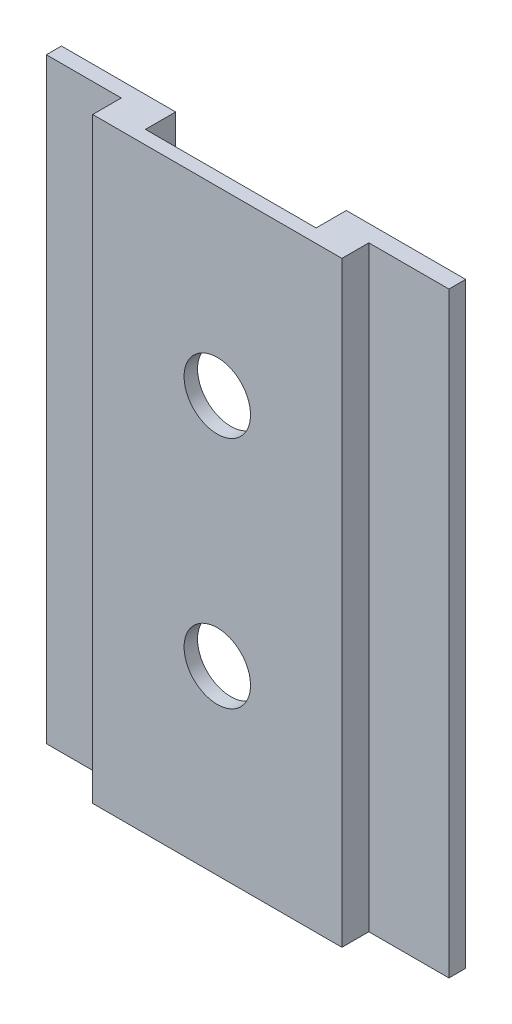
ISO-10303-21;
HEADER;
FILE_DESCRIPTION(('STEP AP214'),'2;1');
FILE_NAME('part.step','',(''),(''),'','','');
FILE_SCHEMA(('AUTOMOTIVE_DESIGN { 1 0 10303 214 1 1 1 1 }'));
ENDSEC;
DATA;
#1=APPLICATION_CONTEXT('core data for automotive mechanical design processes');
#2=APPLICATION_PROTOCOL_DEFINITION('international standard','automotive_design',2000,#1);
#3=PRODUCT_CONTEXT('',#1,'mechanical');
#4=PRODUCT('Part','Part','',(#3));
#5=PRODUCT_RELATED_PRODUCT_CATEGORY('part','',(#4));
#6=PRODUCT_DEFINITION_FORMATION('','',#4);
#7=PRODUCT_DEFINITION_CONTEXT('part definition',#1,'design');
#8=PRODUCT_DEFINITION('design','',#6,#7);
#9=PRODUCT_DEFINITION_SHAPE('','',#8);
#10=(LENGTH_UNIT() NAMED_UNIT(*) SI_UNIT(.MILLI.,.METRE.));
#11=(NAMED_UNIT(*) PLANE_ANGLE_UNIT() SI_UNIT($,.RADIAN.));
#12=(NAMED_UNIT(*) SI_UNIT($,.STERADIAN.) SOLID_ANGLE_UNIT());
#13=UNCERTAINTY_MEASURE_WITH_UNIT(LENGTH_MEASURE(1.E-05),#10,'distance_accuracy_value','');
#14=(GEOMETRIC_REPRESENTATION_CONTEXT(3) GLOBAL_UNCERTAINTY_ASSIGNED_CONTEXT((#13)) GLOBAL_UNIT_ASSIGNED_CONTEXT((#10,
#11,#12)) REPRESENTATION_CONTEXT('',''));
#15=CARTESIAN_POINT('',(0.,0.,0.));
#16=DIRECTION('',(0.,0.,1.));
#17=DIRECTION('',(1.,0.,0.));
#18=AXIS2_PLACEMENT_3D('',#15,#16,#17);
#19=CARTESIAN_POINT('',(0.,50.165,-2.40322636926087));
#20=DIRECTION('',(1.,0.,0.));
#21=DIRECTION('',(0.,0.,-1.));
#22=AXIS2_PLACEMENT_3D('',#19,#20,#21);
#23=PLANE('',#22);
#24=DIRECTION('',(0.,0.,1.));
#25=VECTOR('',#24,1.);
#26=CARTESIAN_POINT('',(0.,0.,-2.40322636926087));
#27=LINE('',#26,#25);
#28=CARTESIAN_POINT('',(0.,0.,-2.40322636926087));
#29=VERTEX_POINT('',#28);
#30=CARTESIAN_POINT('',(0.,0.,0.));
#31=VERTEX_POINT('',#30);
#32=EDGE_CURVE('E166',#29,#31,#27,.T.);
#33=ORIENTED_EDGE('',*,*,#32,.T.);
#34=DIRECTION('',(0.,-1.,0.));
#35=VECTOR('',#34,1.);
#36=CARTESIAN_POINT('',(0.,50.165,0.));
#37=LINE('',#36,#35);
#38=CARTESIAN_POINT('',(0.,50.165,0.));
#39=VERTEX_POINT('',#38);
#40=EDGE_CURVE('E11',#39,#31,#37,.T.);
#41=ORIENTED_EDGE('',*,*,#40,.F.);
#42=DIRECTION('',(0.,0.,1.));
#43=VECTOR('',#42,1.);
#44=CARTESIAN_POINT('',(0.,50.165,-2.40322636926087));
#45=LINE('',#44,#43);
#46=CARTESIAN_POINT('',(0.,50.165,-2.40322636926087));
#47=VERTEX_POINT('',#46);
#48=EDGE_CURVE('E195',#47,#39,#45,.T.);
#49=ORIENTED_EDGE('',*,*,#48,.F.);
#50=DIRECTION('',(0.,-1.,0.));
#51=VECTOR('',#50,1.);
#52=CARTESIAN_POINT('',(0.,50.165,-2.40322636926087));
#53=LINE('',#52,#51);
#54=EDGE_CURVE('E162',#47,#29,#53,.T.);
#55=ORIENTED_EDGE('',*,*,#54,.T.);
#56=EDGE_LOOP('',(#33,#41,#49,#55));
#57=FACE_BOUND('',#56,.T.);
#58=ADVANCED_FACE('F41',(#57),#23,.F.);
#59=CARTESIAN_POINT('',(0.,50.165,0.));
#60=DIRECTION('',(0.,0.,-1.));
#61=DIRECTION('',(-1.,0.,0.));
#62=AXIS2_PLACEMENT_3D('',#59,#60,#61);
#63=PLANE('',#62);
#64=CARTESIAN_POINT('',(10.4775,15.24,0.));
#65=DIRECTION('',(0.,0.,-1.));
#66=DIRECTION('',(-1.,0.,0.));
#67=AXIS2_PLACEMENT_3D('',#64,#65,#66);
#68=CIRCLE('',#67,2.794);
#69=CARTESIAN_POINT('',(7.6835,15.24,0.));
#70=VERTEX_POINT('',#69);
#71=EDGE_CURVE('E375',#70,#70,#68,.T.);
#72=ORIENTED_EDGE('',*,*,#71,.T.);
#73=EDGE_LOOP('',(#72));
#74=FACE_BOUND('',#73,.T.);
#75=CARTESIAN_POINT('',(10.4775,34.925,0.));
#76=DIRECTION('',(0.,0.,-1.));
#77=DIRECTION('',(-1.,0.,0.));
#78=AXIS2_PLACEMENT_3D('',#75,#76,#77);
#79=CIRCLE('',#78,2.794);
#80=CARTESIAN_POINT('',(7.6835,34.925,0.));
#81=VERTEX_POINT('',#80);
#82=EDGE_CURVE('E171',#81,#81,#79,.T.);
#83=ORIENTED_EDGE('',*,*,#82,.T.);
#84=EDGE_LOOP('',(#83));
#85=FACE_BOUND('',#84,.T.);
#86=DIRECTION('',(1.,0.,0.));
#87=VECTOR('',#86,1.);
#88=CARTESIAN_POINT('',(0.,0.,0.));
#89=LINE('',#88,#87);
#90=CARTESIAN_POINT('',(20.955,0.,0.));
#91=VERTEX_POINT('',#90);
#92=EDGE_CURVE('E170',#31,#91,#89,.T.);
#93=ORIENTED_EDGE('',*,*,#92,.T.);
#94=DIRECTION('',(0.,-1.,0.));
#95=VECTOR('',#94,1.);
#96=CARTESIAN_POINT('',(20.955,50.165,0.));
#97=LINE('',#96,#95);
#98=CARTESIAN_POINT('',(20.955,50.165,0.));
#99=VERTEX_POINT('',#98);
#100=EDGE_CURVE('E50',#99,#91,#97,.T.);
#101=ORIENTED_EDGE('',*,*,#100,.F.);
#102=DIRECTION('',(1.,0.,0.));
#103=VECTOR('',#102,1.);
#104=CARTESIAN_POINT('',(0.,50.165,0.));
#105=LINE('',#104,#103);
#106=EDGE_CURVE('E117',#39,#99,#105,.T.);
#107=ORIENTED_EDGE('',*,*,#106,.F.);
#108=ORIENTED_EDGE('',*,*,#40,.T.);
#109=EDGE_LOOP('',(#93,#101,#107,#108));
#110=FACE_BOUND('',#109,.T.);
#111=ADVANCED_FACE('F276',(#74,#85,#110),#63,.F.);
#112=CARTESIAN_POINT('',(20.955,50.165,0.));
#113=DIRECTION('',(-1.,0.,0.));
#114=DIRECTION('',(0.,0.,1.));
#115=AXIS2_PLACEMENT_3D('',#112,#113,#114);
#116=PLANE('',#115);
#117=DIRECTION('',(0.,0.,-1.));
#118=VECTOR('',#117,1.);
#119=CARTESIAN_POINT('',(20.955,0.,0.));
#120=LINE('',#119,#118);
#121=CARTESIAN_POINT('',(20.955,0.,-2.265814212368));
#122=VERTEX_POINT('',#121);
#123=EDGE_CURVE('E174',#91,#122,#120,.T.);
#124=ORIENTED_EDGE('',*,*,#123,.T.);
#125=DIRECTION('',(0.,-1.,0.));
#126=VECTOR('',#125,1.);
#127=CARTESIAN_POINT('',(20.955,50.165,-2.265814212368));
#128=LINE('',#127,#126);
#129=CARTESIAN_POINT('',(20.955,50.165,-2.265814212368));
#130=VERTEX_POINT('',#129);
#131=EDGE_CURVE('E217',#130,#122,#128,.T.);
#132=ORIENTED_EDGE('',*,*,#131,.F.);
#133=DIRECTION('',(0.,0.,-1.));
#134=VECTOR('',#133,1.);
#135=CARTESIAN_POINT('',(20.955,50.165,0.));
#136=LINE('',#135,#134);
#137=EDGE_CURVE('E225',#99,#130,#136,.T.);
#138=ORIENTED_EDGE('',*,*,#137,.F.);
#139=ORIENTED_EDGE('',*,*,#100,.T.);
#140=EDGE_LOOP('',(#124,#132,#138,#139));
#141=FACE_BOUND('',#140,.T.);
#142=ADVANCED_FACE('F223',(#141),#116,.F.);
#143=CARTESIAN_POINT('',(20.955,50.165,-2.265814212368));
#144=DIRECTION('',(0.,0.,-1.));
#145=DIRECTION('',(-1.,0.,0.));
#146=AXIS2_PLACEMENT_3D('',#143,#144,#145);
#147=PLANE('',#146);
#148=DIRECTION('',(1.,0.,0.));
#149=VECTOR('',#148,1.);
#150=CARTESIAN_POINT('',(20.955,0.,-2.265814212368));
#151=LINE('',#150,#149);
#152=CARTESIAN_POINT('',(27.686,0.,-2.265814212368));
#153=VERTEX_POINT('',#152);
#154=EDGE_CURVE('E176',#122,#153,#151,.T.);
#155=ORIENTED_EDGE('',*,*,#154,.T.);
#156=DIRECTION('',(0.,-1.,0.));
#157=VECTOR('',#156,1.);
#158=CARTESIAN_POINT('',(27.686,50.165,-2.265814212368));
#159=LINE('',#158,#157);
#160=CARTESIAN_POINT('',(27.686,50.165,-2.265814212368));
#161=VERTEX_POINT('',#160);
#162=EDGE_CURVE('E214',#161,#153,#159,.T.);
#163=ORIENTED_EDGE('',*,*,#162,.F.);
#164=DIRECTION('',(1.,0.,0.));
#165=VECTOR('',#164,1.);
#166=CARTESIAN_POINT('',(20.955,50.165,-2.265814212368));
#167=LINE('',#166,#165);
#168=EDGE_CURVE('E243',#130,#161,#167,.T.);
#169=ORIENTED_EDGE('',*,*,#168,.F.);
#170=ORIENTED_EDGE('',*,*,#131,.T.);
#171=EDGE_LOOP('',(#155,#163,#169,#170));
#172=FACE_BOUND('',#171,.T.);
#173=ADVANCED_FACE('F234',(#172),#147,.F.);
#174=CARTESIAN_POINT('',(27.686,50.165,-2.265814212368));
#175=DIRECTION('',(-1.,0.,0.));
#176=DIRECTION('',(0.,0.,1.));
#177=AXIS2_PLACEMENT_3D('',#174,#175,#176);
#178=PLANE('',#177);
#179=DIRECTION('',(0.,0.,-1.));
#180=VECTOR('',#179,1.);
#181=CARTESIAN_POINT('',(27.686,0.,-2.265814212368));
#182=LINE('',#181,#180);
#183=CARTESIAN_POINT('',(27.686,0.,-3.67354563233775));
#184=VERTEX_POINT('',#183);
#185=EDGE_CURVE('E178',#153,#184,#182,.T.);
#186=ORIENTED_EDGE('',*,*,#185,.T.);
#187=DIRECTION('',(0.,-1.,0.));
#188=VECTOR('',#187,1.);
#189=CARTESIAN_POINT('',(27.686,50.165,-3.67354563233775));
#190=LINE('',#189,#188);
#191=CARTESIAN_POINT('',(27.686,50.165,-3.67354563233775));
#192=VERTEX_POINT('',#191);
#193=EDGE_CURVE('E211',#192,#184,#190,.T.);
#194=ORIENTED_EDGE('',*,*,#193,.F.);
#195=DIRECTION('',(0.,0.,-1.));
#196=VECTOR('',#195,1.);
#197=CARTESIAN_POINT('',(27.686,50.165,-2.265814212368));
#198=LINE('',#197,#196);
#199=EDGE_CURVE('E240',#161,#192,#198,.T.);
#200=ORIENTED_EDGE('',*,*,#199,.F.);
#201=ORIENTED_EDGE('',*,*,#162,.T.);
#202=EDGE_LOOP('',(#186,#194,#200,#201));
#203=FACE_BOUND('',#202,.T.);
#204=ADVANCED_FACE('F238',(#203),#178,.F.);
#205=CARTESIAN_POINT('',(27.686,50.165,-3.67354563233775));
#206=DIRECTION('',(0.,0.,1.));
#207=DIRECTION('',(1.,0.,0.));
#208=AXIS2_PLACEMENT_3D('',#205,#206,#207);
#209=PLANE('',#208);
#210=DIRECTION('',(-1.,0.,0.));
#211=VECTOR('',#210,1.);
#212=CARTESIAN_POINT('',(27.686,0.,-3.67354563233775));
#213=LINE('',#212,#211);
#214=CARTESIAN_POINT('',(17.653,0.,-3.67354563233775));
#215=VERTEX_POINT('',#214);
#216=EDGE_CURVE('E180',#184,#215,#213,.T.);
#217=ORIENTED_EDGE('',*,*,#216,.T.);
#218=DIRECTION('',(0.,-1.,0.));
#219=VECTOR('',#218,1.);
#220=CARTESIAN_POINT('',(17.653,50.165,-3.67354563233775));
#221=LINE('',#220,#219);
#222=CARTESIAN_POINT('',(17.653,50.165,-3.67354563233775));
#223=VERTEX_POINT('',#222);
#224=EDGE_CURVE('E208',#223,#215,#221,.T.);
#225=ORIENTED_EDGE('',*,*,#224,.F.);
#226=DIRECTION('',(-1.,0.,0.));
#227=VECTOR('',#226,1.);
#228=CARTESIAN_POINT('',(27.686,50.165,-3.67354563233775));
#229=LINE('',#228,#227);
#230=EDGE_CURVE('E242',#192,#223,#229,.T.);
#231=ORIENTED_EDGE('',*,*,#230,.F.);
#232=ORIENTED_EDGE('',*,*,#193,.T.);
#233=EDGE_LOOP('',(#217,#225,#231,#232));
#234=FACE_BOUND('',#233,.T.);
#235=ADVANCED_FACE('F292',(#234),#209,.F.);
#236=CARTESIAN_POINT('',(17.653,50.165,-3.67354563233775));
#237=DIRECTION('',(1.,0.,0.));
#238=DIRECTION('',(0.,0.,-1.));
#239=AXIS2_PLACEMENT_3D('',#236,#237,#238);
#240=PLANE('',#239);
#241=DIRECTION('',(0.,0.,1.));
#242=VECTOR('',#241,1.);
#243=CARTESIAN_POINT('',(17.653,0.,-3.67354563233775));
#244=LINE('',#243,#242);
#245=CARTESIAN_POINT('',(17.653,0.,-1.132907106184));
#246=VERTEX_POINT('',#245);
#247=EDGE_CURVE('E182',#215,#246,#244,.T.);
#248=ORIENTED_EDGE('',*,*,#247,.T.);
#249=DIRECTION('',(0.,-1.,0.));
#250=VECTOR('',#249,1.);
#251=CARTESIAN_POINT('',(17.653,50.165,-1.132907106184));
#252=LINE('',#251,#250);
#253=CARTESIAN_POINT('',(17.653,50.165,-1.132907106184));
#254=VERTEX_POINT('',#253);
#255=EDGE_CURVE('E205',#254,#246,#252,.T.);
#256=ORIENTED_EDGE('',*,*,#255,.F.);
#257=DIRECTION('',(0.,0.,1.));
#258=VECTOR('',#257,1.);
#259=CARTESIAN_POINT('',(17.653,50.165,-3.67354563233775));
#260=LINE('',#259,#258);
#261=EDGE_CURVE('E245',#223,#254,#260,.T.);
#262=ORIENTED_EDGE('',*,*,#261,.F.);
#263=ORIENTED_EDGE('',*,*,#224,.T.);
#264=EDGE_LOOP('',(#248,#256,#262,#263));
#265=FACE_BOUND('',#264,.T.);
#266=ADVANCED_FACE('F295',(#265),#240,.F.);
#267=CARTESIAN_POINT('',(17.653,50.165,-1.132907106184));
#268=DIRECTION('',(0.,0.,1.));
#269=DIRECTION('',(1.,0.,0.));
#270=AXIS2_PLACEMENT_3D('',#267,#268,#269);
#271=PLANE('',#270);
#272=CARTESIAN_POINT('',(10.4775,15.24,-1.132907106184));
#273=DIRECTION('',(0.,0.,-1.));
#274=DIRECTION('',(1.,0.,0.));
#275=AXIS2_PLACEMENT_3D('',#272,#273,#274);
#276=CIRCLE('',#275,2.794);
#277=CARTESIAN_POINT('',(13.2715,15.24,-1.132907106184));
#278=VERTEX_POINT('',#277);
#279=EDGE_CURVE('E373',#278,#278,#276,.T.);
#280=ORIENTED_EDGE('',*,*,#279,.F.);
#281=EDGE_LOOP('',(#280));
#282=FACE_BOUND('',#281,.T.);
#283=CARTESIAN_POINT('',(10.4775,34.925,-1.132907106184));
#284=DIRECTION('',(0.,0.,-1.));
#285=DIRECTION('',(-1.,0.,0.));
#286=AXIS2_PLACEMENT_3D('',#283,#284,#285);
#287=CIRCLE('',#286,2.794);
#288=CARTESIAN_POINT('',(7.6835,34.925,-1.132907106184));
#289=VERTEX_POINT('',#288);
#290=EDGE_CURVE('E376',#289,#289,#287,.T.);
#291=ORIENTED_EDGE('',*,*,#290,.F.);
#292=EDGE_LOOP('',(#291));
#293=FACE_BOUND('',#292,.T.);
#294=DIRECTION('',(-1.,0.,0.));
#295=VECTOR('',#294,1.);
#296=CARTESIAN_POINT('',(17.653,0.,-1.132907106184));
#297=LINE('',#296,#295);
#298=CARTESIAN_POINT('',(3.302,0.,-1.132907106184));
#299=VERTEX_POINT('',#298);
#300=EDGE_CURVE('E184',#246,#299,#297,.T.);
#301=ORIENTED_EDGE('',*,*,#300,.T.);
#302=DIRECTION('',(0.,-1.,0.));
#303=VECTOR('',#302,1.);
#304=CARTESIAN_POINT('',(3.302,50.165,-1.132907106184));
#305=LINE('',#304,#303);
#306=CARTESIAN_POINT('',(3.302,50.165,-1.132907106184));
#307=VERTEX_POINT('',#306);
#308=EDGE_CURVE('E201',#307,#299,#305,.T.);
#309=ORIENTED_EDGE('',*,*,#308,.F.);
#310=DIRECTION('',(-1.,0.,0.));
#311=VECTOR('',#310,1.);
#312=CARTESIAN_POINT('',(17.653,50.165,-1.132907106184));
#313=LINE('',#312,#311);
#314=EDGE_CURVE('E251',#254,#307,#313,.T.);
#315=ORIENTED_EDGE('',*,*,#314,.F.);
#316=ORIENTED_EDGE('',*,*,#255,.T.);
#317=EDGE_LOOP('',(#301,#309,#315,#316));
#318=FACE_BOUND('',#317,.T.);
#319=ADVANCED_FACE('F257',(#282,#293,#318),#271,.F.);
#320=CARTESIAN_POINT('',(3.302,50.165,-1.132907106184));
#321=DIRECTION('',(-1.,0.,0.));
#322=DIRECTION('',(0.,0.,1.));
#323=AXIS2_PLACEMENT_3D('',#320,#321,#322);
#324=PLANE('',#323);
#325=DIRECTION('',(0.,0.,-1.));
#326=VECTOR('',#325,1.);
#327=CARTESIAN_POINT('',(3.302,0.,-1.132907106184));
#328=LINE('',#327,#326);
#329=CARTESIAN_POINT('',(3.302,0.,-3.67354563233775));
#330=VERTEX_POINT('',#329);
#331=EDGE_CURVE('E187',#299,#330,#328,.T.);
#332=ORIENTED_EDGE('',*,*,#331,.T.);
#333=DIRECTION('',(0.,-1.,0.));
#334=VECTOR('',#333,1.);
#335=CARTESIAN_POINT('',(3.302,50.165,-3.67354563233775));
#336=LINE('',#335,#334);
#337=CARTESIAN_POINT('',(3.302,50.165,-3.67354563233775));
#338=VERTEX_POINT('',#337);
#339=EDGE_CURVE('E157',#338,#330,#336,.T.);
#340=ORIENTED_EDGE('',*,*,#339,.F.);
#341=DIRECTION('',(0.,0.,-1.));
#342=VECTOR('',#341,1.);
#343=CARTESIAN_POINT('',(3.302,50.165,-1.132907106184));
#344=LINE('',#343,#342);
#345=EDGE_CURVE('E148',#307,#338,#344,.T.);
#346=ORIENTED_EDGE('',*,*,#345,.F.);
#347=ORIENTED_EDGE('',*,*,#308,.T.);
#348=EDGE_LOOP('',(#332,#340,#346,#347));
#349=FACE_BOUND('',#348,.T.);
#350=ADVANCED_FACE('F261',(#349),#324,.F.);
#351=CARTESIAN_POINT('',(3.302,50.165,-3.67354563233775));
#352=DIRECTION('',(0.,0.,1.));
#353=DIRECTION('',(1.,0.,0.));
#354=AXIS2_PLACEMENT_3D('',#351,#352,#353);
#355=PLANE('',#354);
#356=DIRECTION('',(-1.,0.,0.));
#357=VECTOR('',#356,1.);
#358=CARTESIAN_POINT('',(3.302,0.,-3.67354563233775));
#359=LINE('',#358,#357);
#360=CARTESIAN_POINT('',(-6.2992,0.,-3.67354563233775));
#361=VERTEX_POINT('',#360);
#362=EDGE_CURVE('E156',#330,#361,#359,.T.);
#363=ORIENTED_EDGE('',*,*,#362,.T.);
#364=DIRECTION('',(0.,-1.,0.));
#365=VECTOR('',#364,1.);
#366=CARTESIAN_POINT('',(-6.2992,50.165,-3.67354563233775));
#367=LINE('',#366,#365);
#368=CARTESIAN_POINT('',(-6.2992,50.165,-3.67354563233775));
#369=VERTEX_POINT('',#368);
#370=EDGE_CURVE('E153',#369,#361,#367,.T.);
#371=ORIENTED_EDGE('',*,*,#370,.F.);
#372=DIRECTION('',(-1.,0.,0.));
#373=VECTOR('',#372,1.);
#374=CARTESIAN_POINT('',(3.302,50.165,-3.67354563233775));
#375=LINE('',#374,#373);
#376=EDGE_CURVE('E142',#338,#369,#375,.T.);
#377=ORIENTED_EDGE('',*,*,#376,.F.);
#378=ORIENTED_EDGE('',*,*,#339,.T.);
#379=EDGE_LOOP('',(#363,#371,#377,#378));
#380=FACE_BOUND('',#379,.T.);
#381=ADVANCED_FACE('F154',(#380),#355,.F.);
#382=CARTESIAN_POINT('',(-6.2992,50.165,-3.67354563233775));
#383=DIRECTION('',(1.,0.,0.));
#384=DIRECTION('',(0.,0.,-1.));
#385=AXIS2_PLACEMENT_3D('',#382,#383,#384);
#386=PLANE('',#385);
#387=DIRECTION('',(0.,0.,1.));
#388=VECTOR('',#387,1.);
#389=CARTESIAN_POINT('',(-6.2992,0.,-3.67354563233775));
#390=LINE('',#389,#388);
#391=CARTESIAN_POINT('',(-6.2992,0.,-2.40322636926087));
#392=VERTEX_POINT('',#391);
#393=EDGE_CURVE('E102',#361,#392,#390,.T.);
#394=ORIENTED_EDGE('',*,*,#393,.T.);
#395=DIRECTION('',(0.,-1.,0.));
#396=VECTOR('',#395,1.);
#397=CARTESIAN_POINT('',(-6.2992,50.165,-2.40322636926087));
#398=LINE('',#397,#396);
#399=CARTESIAN_POINT('',(-6.2992,50.165,-2.40322636926087));
#400=VERTEX_POINT('',#399);
#401=EDGE_CURVE('E158',#400,#392,#398,.T.);
#402=ORIENTED_EDGE('',*,*,#401,.F.);
#403=DIRECTION('',(0.,0.,1.));
#404=VECTOR('',#403,1.);
#405=CARTESIAN_POINT('',(-6.2992,50.165,-3.67354563233775));
#406=LINE('',#405,#404);
#407=EDGE_CURVE('E146',#369,#400,#406,.T.);
#408=ORIENTED_EDGE('',*,*,#407,.F.);
#409=ORIENTED_EDGE('',*,*,#370,.T.);
#410=EDGE_LOOP('',(#394,#402,#408,#409));
#411=FACE_BOUND('',#410,.T.);
#412=ADVANCED_FACE('F160',(#411),#386,.F.);
#413=CARTESIAN_POINT('',(-6.2992,50.165,-2.40322636926087));
#414=DIRECTION('',(0.,0.,-1.));
#415=DIRECTION('',(-1.,0.,0.));
#416=AXIS2_PLACEMENT_3D('',#413,#414,#415);
#417=PLANE('',#416);
#418=DIRECTION('',(1.,0.,0.));
#419=VECTOR('',#418,1.);
#420=CARTESIAN_POINT('',(-6.2992,0.,-2.40322636926087));
#421=LINE('',#420,#419);
#422=EDGE_CURVE('E109',#392,#29,#421,.T.);
#423=ORIENTED_EDGE('',*,*,#422,.T.);
#424=ORIENTED_EDGE('',*,*,#54,.F.);
#425=DIRECTION('',(1.,0.,0.));
#426=VECTOR('',#425,1.);
#427=CARTESIAN_POINT('',(-6.2992,50.165,-2.40322636926087));
#428=LINE('',#427,#426);
#429=EDGE_CURVE('E58',#400,#47,#428,.T.);
#430=ORIENTED_EDGE('',*,*,#429,.F.);
#431=ORIENTED_EDGE('',*,*,#401,.T.);
#432=EDGE_LOOP('',(#423,#424,#430,#431));
#433=FACE_BOUND('',#432,.T.);
#434=ADVANCED_FACE('F265',(#433),#417,.F.);
#435=CARTESIAN_POINT('',(0.,50.165,0.));
#436=DIRECTION('',(0.,1.,0.));
#437=DIRECTION('',(0.,0.,1.));
#438=AXIS2_PLACEMENT_3D('',#435,#436,#437);
#439=PLANE('',#438);
#440=ORIENTED_EDGE('',*,*,#48,.T.);
#441=ORIENTED_EDGE('',*,*,#106,.T.);
#442=ORIENTED_EDGE('',*,*,#137,.T.);
#443=ORIENTED_EDGE('',*,*,#168,.T.);
#444=ORIENTED_EDGE('',*,*,#199,.T.);
#445=ORIENTED_EDGE('',*,*,#230,.T.);
#446=ORIENTED_EDGE('',*,*,#261,.T.);
#447=ORIENTED_EDGE('',*,*,#314,.T.);
#448=ORIENTED_EDGE('',*,*,#345,.T.);
#449=ORIENTED_EDGE('',*,*,#376,.T.);
#450=ORIENTED_EDGE('',*,*,#407,.T.);
#451=ORIENTED_EDGE('',*,*,#429,.T.);
#452=EDGE_LOOP('',(#440,#441,#442,#443,#444,#445,#446,#447,#448,#449,#450,#451));
#453=FACE_BOUND('',#452,.T.);
#454=ADVANCED_FACE('F144',(#453),#439,.T.);
#455=CARTESIAN_POINT('',(0.,0.,0.));
#456=DIRECTION('',(0.,1.,0.));
#457=DIRECTION('',(0.,0.,1.));
#458=AXIS2_PLACEMENT_3D('',#455,#456,#457);
#459=PLANE('',#458);
#460=ORIENTED_EDGE('',*,*,#32,.F.);
#461=ORIENTED_EDGE('',*,*,#422,.F.);
#462=ORIENTED_EDGE('',*,*,#393,.F.);
#463=ORIENTED_EDGE('',*,*,#362,.F.);
#464=ORIENTED_EDGE('',*,*,#331,.F.);
#465=ORIENTED_EDGE('',*,*,#300,.F.);
#466=ORIENTED_EDGE('',*,*,#247,.F.);
#467=ORIENTED_EDGE('',*,*,#216,.F.);
#468=ORIENTED_EDGE('',*,*,#185,.F.);
#469=ORIENTED_EDGE('',*,*,#154,.F.);
#470=ORIENTED_EDGE('',*,*,#123,.F.);
#471=ORIENTED_EDGE('',*,*,#92,.F.);
#472=EDGE_LOOP('',(#460,#461,#462,#463,#464,#465,#466,#467,#468,#469,#470,#471));
#473=FACE_BOUND('',#472,.T.);
#474=ADVANCED_FACE('F229',(#473),#459,.F.);
#475=CARTESIAN_POINT('',(10.4775,34.925,49.032092893816));
#476=DIRECTION('',(0.,0.,-1.));
#477=DIRECTION('',(-1.,0.,0.));
#478=AXIS2_PLACEMENT_3D('',#475,#476,#477);
#479=CYLINDRICAL_SURFACE('',#478,2.794);
#480=ORIENTED_EDGE('',*,*,#290,.T.);
#481=EDGE_LOOP('',(#480));
#482=FACE_BOUND('',#481,.T.);
#483=ORIENTED_EDGE('',*,*,#82,.F.);
#484=EDGE_LOOP('',(#483));
#485=FACE_BOUND('',#484,.T.);
#486=ADVANCED_FACE('F333',(#482,#485),#479,.F.);
#487=CARTESIAN_POINT('',(10.4775,15.24,49.032092893816));
#488=DIRECTION('',(0.,0.,-1.));
#489=DIRECTION('',(-1.,0.,0.));
#490=AXIS2_PLACEMENT_3D('',#487,#488,#489);
#491=CYLINDRICAL_SURFACE('',#490,2.794);
#492=ORIENTED_EDGE('',*,*,#279,.T.);
#493=EDGE_LOOP('',(#492));
#494=FACE_BOUND('',#493,.T.);
#495=ORIENTED_EDGE('',*,*,#71,.F.);
#496=EDGE_LOOP('',(#495));
#497=FACE_BOUND('',#496,.T.);
#498=ADVANCED_FACE('F356',(#494,#497),#491,.F.);
#499=CLOSED_SHELL('',(#58,#111,#142,#173,#204,#235,#266,#319,#350,#381,#412,#434,#454,#474,#486,#498));
#500=MANIFOLD_SOLID_BREP('B2',#499);
#501=ADVANCED_BREP_SHAPE_REPRESENTATION('',(#18,#500),#14);
#502=SHAPE_DEFINITION_REPRESENTATION(#9,#501);
ENDSEC;
END-ISO-10303-21;
